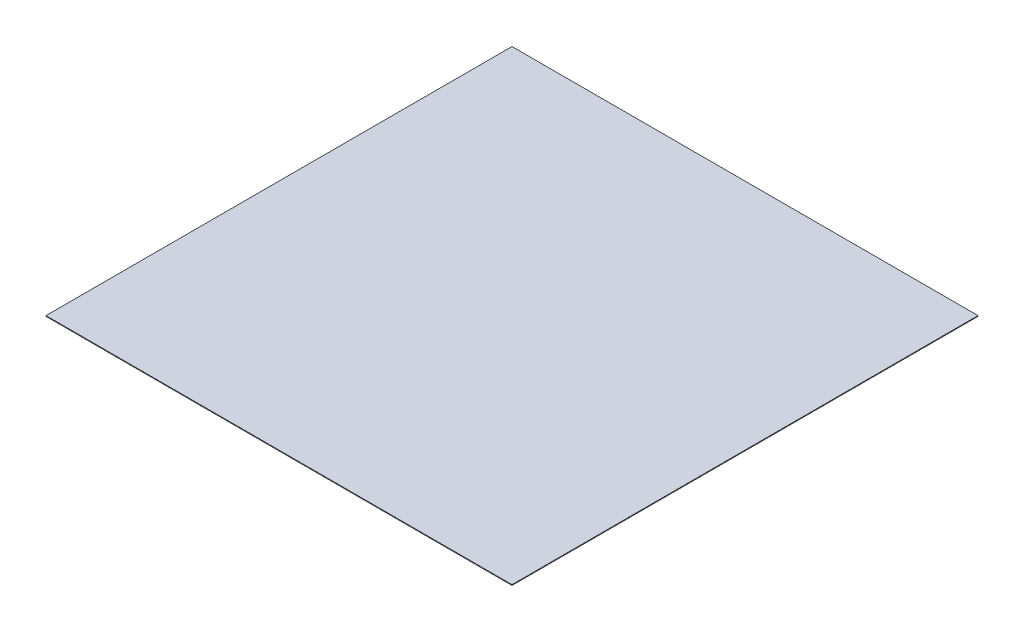
ISO-10303-21;
HEADER;
FILE_DESCRIPTION(('STEP AP214'),'2;1');
FILE_NAME('part.step','',(''),(''),'','','');
FILE_SCHEMA(('AUTOMOTIVE_DESIGN { 1 0 10303 214 1 1 1 1 }'));
ENDSEC;
DATA;
#1=APPLICATION_CONTEXT('core data for automotive mechanical design processes');
#2=APPLICATION_PROTOCOL_DEFINITION('international standard','automotive_design',2000,#1);
#3=PRODUCT_CONTEXT('',#1,'mechanical');
#4=PRODUCT('Part','Part','',(#3));
#5=PRODUCT_RELATED_PRODUCT_CATEGORY('part','',(#4));
#6=PRODUCT_DEFINITION_FORMATION('','',#4);
#7=PRODUCT_DEFINITION_CONTEXT('part definition',#1,'design');
#8=PRODUCT_DEFINITION('design','',#6,#7);
#9=PRODUCT_DEFINITION_SHAPE('','',#8);
#10=(LENGTH_UNIT() NAMED_UNIT(*) SI_UNIT(.MILLI.,.METRE.));
#11=(NAMED_UNIT(*) PLANE_ANGLE_UNIT() SI_UNIT($,.RADIAN.));
#12=(NAMED_UNIT(*) SI_UNIT($,.STERADIAN.) SOLID_ANGLE_UNIT());
#13=UNCERTAINTY_MEASURE_WITH_UNIT(LENGTH_MEASURE(1.E-05),#10,'distance_accuracy_value','');
#14=(GEOMETRIC_REPRESENTATION_CONTEXT(3) GLOBAL_UNCERTAINTY_ASSIGNED_CONTEXT((#13)) GLOBAL_UNIT_ASSIGNED_CONTEXT((#10,
#11,#12)) REPRESENTATION_CONTEXT('',''));
#15=CARTESIAN_POINT('',(0.,0.,0.));
#16=DIRECTION('',(0.,0.,1.));
#17=DIRECTION('',(1.,0.,0.));
#18=AXIS2_PLACEMENT_3D('',#15,#16,#17);
#19=CARTESIAN_POINT('',(662.5,2.,662.5));
#20=DIRECTION('',(-1.,0.,0.));
#21=DIRECTION('',(0.,0.,1.));
#22=AXIS2_PLACEMENT_3D('',#19,#20,#21);
#23=PLANE('',#22);
#24=DIRECTION('',(0.,0.,-1.));
#25=VECTOR('',#24,1.);
#26=CARTESIAN_POINT('',(662.5,0.,662.5));
#27=LINE('',#26,#25);
#28=CARTESIAN_POINT('',(662.5,0.,662.5));
#29=VERTEX_POINT('',#28);
#30=CARTESIAN_POINT('',(662.5,0.,-662.5));
#31=VERTEX_POINT('',#30);
#32=EDGE_CURVE('E95',#29,#31,#27,.T.);
#33=ORIENTED_EDGE('',*,*,#32,.T.);
#34=DIRECTION('',(0.,-1.,0.));
#35=VECTOR('',#34,1.);
#36=CARTESIAN_POINT('',(662.5,2.,-662.5));
#37=LINE('',#36,#35);
#38=CARTESIAN_POINT('',(662.5,2.,-662.5));
#39=VERTEX_POINT('',#38);
#40=EDGE_CURVE('E11',#39,#31,#37,.T.);
#41=ORIENTED_EDGE('',*,*,#40,.F.);
#42=DIRECTION('',(0.,0.,-1.));
#43=VECTOR('',#42,1.);
#44=CARTESIAN_POINT('',(662.5,2.,662.5));
#45=LINE('',#44,#43);
#46=CARTESIAN_POINT('',(662.5,2.,662.5));
#47=VERTEX_POINT('',#46);
#48=EDGE_CURVE('E83',#47,#39,#45,.T.);
#49=ORIENTED_EDGE('',*,*,#48,.F.);
#50=DIRECTION('',(0.,-1.,0.));
#51=VECTOR('',#50,1.);
#52=CARTESIAN_POINT('',(662.5,2.,662.5));
#53=LINE('',#52,#51);
#54=EDGE_CURVE('E91',#47,#29,#53,.T.);
#55=ORIENTED_EDGE('',*,*,#54,.T.);
#56=EDGE_LOOP('',(#33,#41,#49,#55));
#57=FACE_BOUND('',#56,.T.);
#58=ADVANCED_FACE('F32',(#57),#23,.F.);
#59=CARTESIAN_POINT('',(-662.5,2.,-662.5));
#60=DIRECTION('',(0.,0.,1.));
#61=DIRECTION('',(1.,0.,0.));
#62=AXIS2_PLACEMENT_3D('',#59,#60,#61);
#63=PLANE('',#62);
#64=DIRECTION('',(-1.,0.,0.));
#65=VECTOR('',#64,1.);
#66=CARTESIAN_POINT('',(-662.5,0.,-662.5));
#67=LINE('',#66,#65);
#68=CARTESIAN_POINT('',(-662.5,0.,-662.5));
#69=VERTEX_POINT('',#68);
#70=EDGE_CURVE('E87',#31,#69,#67,.T.);
#71=ORIENTED_EDGE('',*,*,#70,.T.);
#72=DIRECTION('',(0.,-1.,0.));
#73=VECTOR('',#72,1.);
#74=CARTESIAN_POINT('',(-662.5,2.,-662.5));
#75=LINE('',#74,#73);
#76=CARTESIAN_POINT('',(-662.5,2.,-662.5));
#77=VERTEX_POINT('',#76);
#78=EDGE_CURVE('E40',#77,#69,#75,.T.);
#79=ORIENTED_EDGE('',*,*,#78,.F.);
#80=DIRECTION('',(-1.,0.,0.));
#81=VECTOR('',#80,1.);
#82=CARTESIAN_POINT('',(-662.5,2.,-662.5));
#83=LINE('',#82,#81);
#84=EDGE_CURVE('E78',#39,#77,#83,.T.);
#85=ORIENTED_EDGE('',*,*,#84,.F.);
#86=ORIENTED_EDGE('',*,*,#40,.T.);
#87=EDGE_LOOP('',(#71,#79,#85,#86));
#88=FACE_BOUND('',#87,.T.);
#89=ADVANCED_FACE('F86',(#88),#63,.F.);
#90=CARTESIAN_POINT('',(-662.5,2.,662.5));
#91=DIRECTION('',(1.,0.,0.));
#92=DIRECTION('',(0.,0.,-1.));
#93=AXIS2_PLACEMENT_3D('',#90,#91,#92);
#94=PLANE('',#93);
#95=DIRECTION('',(0.,0.,1.));
#96=VECTOR('',#95,1.);
#97=CARTESIAN_POINT('',(-662.5,0.,662.5));
#98=LINE('',#97,#96);
#99=CARTESIAN_POINT('',(-662.5,0.,662.5));
#100=VERTEX_POINT('',#99);
#101=EDGE_CURVE('E65',#69,#100,#98,.T.);
#102=ORIENTED_EDGE('',*,*,#101,.T.);
#103=DIRECTION('',(0.,-1.,0.));
#104=VECTOR('',#103,1.);
#105=CARTESIAN_POINT('',(-662.5,2.,662.5));
#106=LINE('',#105,#104);
#107=CARTESIAN_POINT('',(-662.5,2.,662.5));
#108=VERTEX_POINT('',#107);
#109=EDGE_CURVE('E88',#108,#100,#106,.T.);
#110=ORIENTED_EDGE('',*,*,#109,.F.);
#111=DIRECTION('',(0.,0.,1.));
#112=VECTOR('',#111,1.);
#113=CARTESIAN_POINT('',(-662.5,2.,662.5));
#114=LINE('',#113,#112);
#115=EDGE_CURVE('E81',#77,#108,#114,.T.);
#116=ORIENTED_EDGE('',*,*,#115,.F.);
#117=ORIENTED_EDGE('',*,*,#78,.T.);
#118=EDGE_LOOP('',(#102,#110,#116,#117));
#119=FACE_BOUND('',#118,.T.);
#120=ADVANCED_FACE('F89',(#119),#94,.F.);
#121=CARTESIAN_POINT('',(-662.5,2.,662.5));
#122=DIRECTION('',(0.,0.,-1.));
#123=DIRECTION('',(-1.,0.,0.));
#124=AXIS2_PLACEMENT_3D('',#121,#122,#123);
#125=PLANE('',#124);
#126=DIRECTION('',(1.,0.,0.));
#127=VECTOR('',#126,1.);
#128=CARTESIAN_POINT('',(-662.5,0.,662.5));
#129=LINE('',#128,#127);
#130=EDGE_CURVE('E71',#100,#29,#129,.T.);
#131=ORIENTED_EDGE('',*,*,#130,.T.);
#132=ORIENTED_EDGE('',*,*,#54,.F.);
#133=DIRECTION('',(1.,0.,0.));
#134=VECTOR('',#133,1.);
#135=CARTESIAN_POINT('',(-662.5,2.,662.5));
#136=LINE('',#135,#134);
#137=EDGE_CURVE('E48',#108,#47,#136,.T.);
#138=ORIENTED_EDGE('',*,*,#137,.F.);
#139=ORIENTED_EDGE('',*,*,#109,.T.);
#140=EDGE_LOOP('',(#131,#132,#138,#139));
#141=FACE_BOUND('',#140,.T.);
#142=ADVANCED_FACE('F102',(#141),#125,.F.);
#143=CARTESIAN_POINT('',(0.,2.,0.));
#144=DIRECTION('',(0.,-1.,0.));
#145=DIRECTION('',(0.,0.,-1.));
#146=AXIS2_PLACEMENT_3D('',#143,#144,#145);
#147=PLANE('',#146);
#148=ORIENTED_EDGE('',*,*,#48,.T.);
#149=ORIENTED_EDGE('',*,*,#84,.T.);
#150=ORIENTED_EDGE('',*,*,#115,.T.);
#151=ORIENTED_EDGE('',*,*,#137,.T.);
#152=EDGE_LOOP('',(#148,#149,#150,#151));
#153=FACE_BOUND('',#152,.T.);
#154=ADVANCED_FACE('F79',(#153),#147,.F.);
#155=CARTESIAN_POINT('',(0.,0.,0.));
#156=DIRECTION('',(0.,-1.,0.));
#157=DIRECTION('',(0.,0.,-1.));
#158=AXIS2_PLACEMENT_3D('',#155,#156,#157);
#159=PLANE('',#158);
#160=ORIENTED_EDGE('',*,*,#32,.F.);
#161=ORIENTED_EDGE('',*,*,#130,.F.);
#162=ORIENTED_EDGE('',*,*,#101,.F.);
#163=ORIENTED_EDGE('',*,*,#70,.F.);
#164=EDGE_LOOP('',(#160,#161,#162,#163));
#165=FACE_BOUND('',#164,.T.);
#166=ADVANCED_FACE('F105',(#165),#159,.T.);
#167=CLOSED_SHELL('',(#58,#89,#120,#142,#154,#166));
#168=MANIFOLD_SOLID_BREP('B2',#167);
#169=ADVANCED_BREP_SHAPE_REPRESENTATION('',(#18,#168),#14);
#170=SHAPE_DEFINITION_REPRESENTATION(#9,#169);
ENDSEC;
END-ISO-10303-21;
